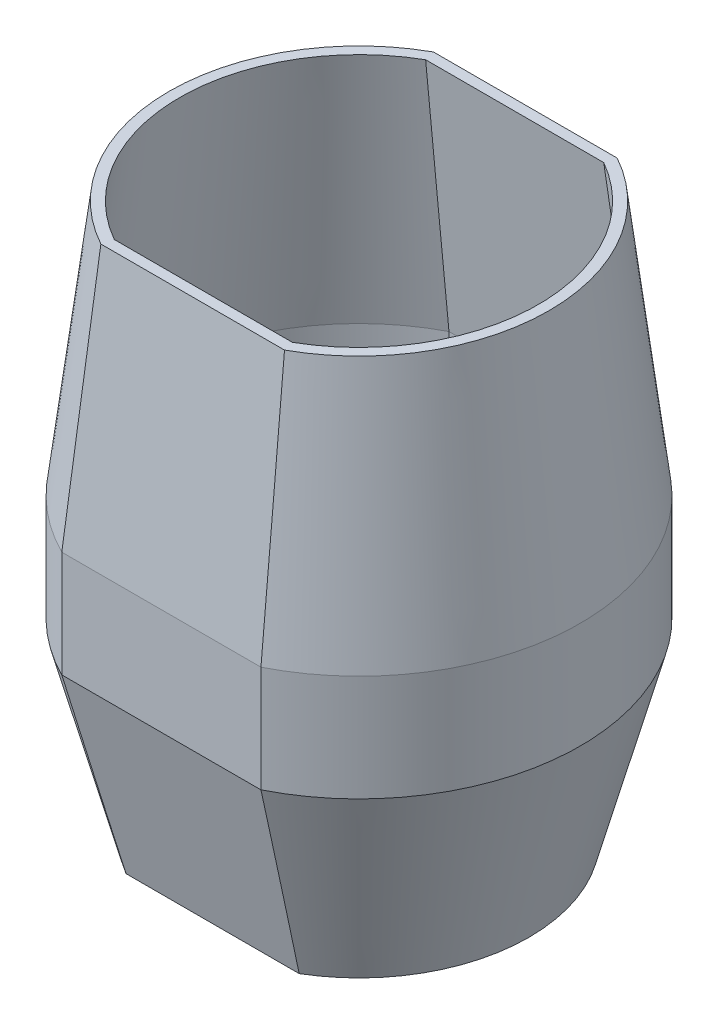
ISO-10303-21;
HEADER;
FILE_DESCRIPTION(('STEP AP214'),'2;1');
FILE_NAME('part.step','',(''),(''),'','','');
FILE_SCHEMA(('AUTOMOTIVE_DESIGN { 1 0 10303 214 1 1 1 1 }'));
ENDSEC;
DATA;
#1=APPLICATION_CONTEXT('core data for automotive mechanical design processes');
#2=APPLICATION_PROTOCOL_DEFINITION('international standard','automotive_design',2000,#1);
#3=PRODUCT_CONTEXT('',#1,'mechanical');
#4=PRODUCT('Part','Part','',(#3));
#5=PRODUCT_RELATED_PRODUCT_CATEGORY('part','',(#4));
#6=PRODUCT_DEFINITION_FORMATION('','',#4);
#7=PRODUCT_DEFINITION_CONTEXT('part definition',#1,'design');
#8=PRODUCT_DEFINITION('design','',#6,#7);
#9=PRODUCT_DEFINITION_SHAPE('','',#8);
#10=(LENGTH_UNIT() NAMED_UNIT(*) SI_UNIT(.MILLI.,.METRE.));
#11=(NAMED_UNIT(*) PLANE_ANGLE_UNIT() SI_UNIT($,.RADIAN.));
#12=(NAMED_UNIT(*) SI_UNIT($,.STERADIAN.) SOLID_ANGLE_UNIT());
#13=UNCERTAINTY_MEASURE_WITH_UNIT(LENGTH_MEASURE(1.E-05),#10,'distance_accuracy_value','');
#14=(GEOMETRIC_REPRESENTATION_CONTEXT(3) GLOBAL_UNCERTAINTY_ASSIGNED_CONTEXT((#13)) GLOBAL_UNIT_ASSIGNED_CONTEXT((#10,
#11,#12)) REPRESENTATION_CONTEXT('',''));
#15=CARTESIAN_POINT('',(0.,0.,0.));
#16=DIRECTION('',(0.,0.,1.));
#17=DIRECTION('',(1.,0.,0.));
#18=AXIS2_PLACEMENT_3D('',#15,#16,#17);
#19=CARTESIAN_POINT('',(0.,260.,0.));
#20=DIRECTION('',(0.,1.,0.));
#21=DIRECTION('',(0.,0.,1.));
#22=AXIS2_PLACEMENT_3D('',#19,#20,#21);
#23=PLANE('',#22);
#24=DIRECTION('',(1.,0.,0.));
#25=VECTOR('',#24,1.);
#26=CARTESIAN_POINT('',(46.8473814173537,260.,-78.2462004007966));
#27=LINE('',#26,#25);
#28=CARTESIAN_POINT('',(43.2035338733453,260.,-78.2462004007966));
#29=VERTEX_POINT('',#28);
#30=CARTESIAN_POINT('',(-43.2035338733453,260.,-78.2462004007966));
#31=VERTEX_POINT('',#30);
#32=EDGE_CURVE('E355',#29,#31,#27,.F.);
#33=ORIENTED_EDGE('',*,*,#32,.T.);
#34=CARTESIAN_POINT('',(0.,260.,0.));
#35=DIRECTION('',(0.,1.,0.));
#36=DIRECTION('',(0.,0.,1.));
#37=AXIS2_PLACEMENT_3D('',#34,#35,#36);
#38=CIRCLE('',#37,89.3812800104525);
#39=CARTESIAN_POINT('',(-43.2035338733452,260.,78.2462004007967));
#40=VERTEX_POINT('',#39);
#41=EDGE_CURVE('E508',#31,#40,#38,.T.);
#42=ORIENTED_EDGE('',*,*,#41,.T.);
#43=DIRECTION('',(-1.,0.,0.));
#44=VECTOR('',#43,1.);
#45=CARTESIAN_POINT('',(-46.8473814173535,260.,78.2462004007967));
#46=LINE('',#45,#44);
#47=CARTESIAN_POINT('',(43.2035338733452,260.,78.2462004007967));
#48=VERTEX_POINT('',#47);
#49=EDGE_CURVE('E502',#40,#48,#46,.F.);
#50=ORIENTED_EDGE('',*,*,#49,.T.);
#51=CARTESIAN_POINT('',(0.,260.,0.));
#52=DIRECTION('',(0.,1.,0.));
#53=DIRECTION('',(0.,0.,1.));
#54=AXIS2_PLACEMENT_3D('',#51,#52,#53);
#55=CIRCLE('',#54,89.3812800104525);
#56=EDGE_CURVE('E498',#48,#29,#55,.T.);
#57=ORIENTED_EDGE('',*,*,#56,.T.);
#58=EDGE_LOOP('',(#33,#42,#50,#57));
#59=FACE_BOUND('',#58,.T.);
#60=DIRECTION('',(-1.,0.,0.));
#61=VECTOR('',#60,1.);
#62=CARTESIAN_POINT('',(0.,260.,-73.2462004007966));
#63=LINE('',#62,#61);
#64=CARTESIAN_POINT('',(41.895041986478,260.,-73.2462004007966));
#65=VERTEX_POINT('',#64);
#66=CARTESIAN_POINT('',(-41.895041986478,260.,-73.2462004007966));
#67=VERTEX_POINT('',#66);
#68=EDGE_CURVE('E12',#65,#67,#63,.T.);
#69=ORIENTED_EDGE('',*,*,#68,.F.);
#70=CARTESIAN_POINT('',(0.,260.,0.));
#71=DIRECTION('',(0.,1.,0.));
#72=DIRECTION('',(0.,0.,1.));
#73=AXIS2_PLACEMENT_3D('',#70,#71,#72);
#74=CIRCLE('',#73,84.3812800104525);
#75=CARTESIAN_POINT('',(41.8950419864777,260.,73.2462004007966));
#76=VERTEX_POINT('',#75);
#77=EDGE_CURVE('E181',#65,#76,#74,.F.);
#78=ORIENTED_EDGE('',*,*,#77,.T.);
#79=DIRECTION('',(1.,0.,0.));
#80=VECTOR('',#79,1.);
#81=CARTESIAN_POINT('',(0.,260.,73.2462004007966));
#82=LINE('',#81,#80);
#83=CARTESIAN_POINT('',(-41.8950419864779,260.,73.2462004007966));
#84=VERTEX_POINT('',#83);
#85=EDGE_CURVE('E343',#76,#84,#82,.F.);
#86=ORIENTED_EDGE('',*,*,#85,.T.);
#87=CARTESIAN_POINT('',(0.,260.,0.));
#88=DIRECTION('',(0.,1.,0.));
#89=DIRECTION('',(0.,0.,1.));
#90=AXIS2_PLACEMENT_3D('',#87,#88,#89);
#91=CIRCLE('',#90,84.3812800104525);
#92=EDGE_CURVE('E72',#84,#67,#91,.F.);
#93=ORIENTED_EDGE('',*,*,#92,.T.);
#94=EDGE_LOOP('',(#69,#78,#86,#93));
#95=FACE_BOUND('',#94,.T.);
#96=ADVANCED_FACE('F63',(#59,#95),#23,.T.);
#97=CARTESIAN_POINT('',(0.,0.,0.));
#98=DIRECTION('',(0.,1.,0.));
#99=DIRECTION('',(0.,0.,1.));
#100=AXIS2_PLACEMENT_3D('',#97,#98,#99);
#101=PLANE('',#100);
#102=CARTESIAN_POINT('',(0.,0.,0.));
#103=DIRECTION('',(0.,1.,0.));
#104=DIRECTION('',(0.,0.,1.));
#105=AXIS2_PLACEMENT_3D('',#102,#103,#104);
#106=CIRCLE('',#105,80.);
#107=CARTESIAN_POINT('',(-40.7139133421435,0.,-68.8649203903441));
#108=VERTEX_POINT('',#107);
#109=CARTESIAN_POINT('',(-40.7139133421434,0.,68.8649203903441));
#110=VERTEX_POINT('',#109);
#111=EDGE_CURVE('E258',#108,#110,#106,.T.);
#112=ORIENTED_EDGE('',*,*,#111,.F.);
#113=DIRECTION('',(1.,0.,0.));
#114=VECTOR('',#113,1.);
#115=CARTESIAN_POINT('',(-40.7139133421435,0.,-68.8649203903441));
#116=LINE('',#115,#114);
#117=CARTESIAN_POINT('',(40.7139133421435,0.,-68.8649203903441));
#118=VERTEX_POINT('',#117);
#119=EDGE_CURVE('E333',#108,#118,#116,.T.);
#120=ORIENTED_EDGE('',*,*,#119,.T.);
#121=CARTESIAN_POINT('',(0.,0.,0.));
#122=DIRECTION('',(0.,1.,0.));
#123=DIRECTION('',(0.,0.,1.));
#124=AXIS2_PLACEMENT_3D('',#121,#122,#123);
#125=CIRCLE('',#124,80.);
#126=CARTESIAN_POINT('',(40.7139133421434,0.,68.8649203903441));
#127=VERTEX_POINT('',#126);
#128=EDGE_CURVE('E533',#127,#118,#125,.T.);
#129=ORIENTED_EDGE('',*,*,#128,.F.);
#130=DIRECTION('',(1.,0.,0.));
#131=VECTOR('',#130,1.);
#132=CARTESIAN_POINT('',(-40.7139133421434,0.,68.8649203903441));
#133=LINE('',#132,#131);
#134=EDGE_CURVE('E484',#110,#127,#133,.T.);
#135=ORIENTED_EDGE('',*,*,#134,.F.);
#136=EDGE_LOOP('',(#112,#120,#129,#135));
#137=FACE_BOUND('',#136,.T.);
#138=CARTESIAN_POINT('',(0.,0.,0.));
#139=DIRECTION('',(0.,1.,0.));
#140=DIRECTION('',(0.,0.,1.));
#141=AXIS2_PLACEMENT_3D('',#138,#139,#140);
#142=CIRCLE('',#141,75.);
#143=CARTESIAN_POINT('',(39.3226645019766,0.,63.8649203903441));
#144=VERTEX_POINT('',#143);
#145=CARTESIAN_POINT('',(39.3226645019766,0.,-63.8649203903441));
#146=VERTEX_POINT('',#145);
#147=EDGE_CURVE('E241',#144,#146,#142,.T.);
#148=ORIENTED_EDGE('',*,*,#147,.T.);
#149=DIRECTION('',(1.,0.,0.));
#150=VECTOR('',#149,1.);
#151=CARTESIAN_POINT('',(-39.3226645019766,0.,-63.8649203903441));
#152=LINE('',#151,#150);
#153=CARTESIAN_POINT('',(-39.3226645019766,0.,-63.8649203903441));
#154=VERTEX_POINT('',#153);
#155=EDGE_CURVE('E87',#154,#146,#152,.T.);
#156=ORIENTED_EDGE('',*,*,#155,.F.);
#157=CARTESIAN_POINT('',(0.,0.,0.));
#158=DIRECTION('',(0.,1.,0.));
#159=DIRECTION('',(0.,0.,1.));
#160=AXIS2_PLACEMENT_3D('',#157,#158,#159);
#161=CIRCLE('',#160,75.);
#162=CARTESIAN_POINT('',(-39.3226645019766,0.,63.8649203903441));
#163=VERTEX_POINT('',#162);
#164=EDGE_CURVE('E247',#154,#163,#161,.T.);
#165=ORIENTED_EDGE('',*,*,#164,.T.);
#166=DIRECTION('',(1.,0.,0.));
#167=VECTOR('',#166,1.);
#168=CARTESIAN_POINT('',(-39.3226645019765,0.,63.8649203903441));
#169=LINE('',#168,#167);
#170=EDGE_CURVE('E244',#163,#144,#169,.T.);
#171=ORIENTED_EDGE('',*,*,#170,.T.);
#172=EDGE_LOOP('',(#148,#156,#165,#171));
#173=FACE_BOUND('',#172,.T.);
#174=ADVANCED_FACE('F295',(#137,#173),#101,.F.);
#175=CARTESIAN_POINT('',(0.,0.,0.));
#176=DIRECTION('',(0.,1.,0.));
#177=DIRECTION('',(0.,0.,1.));
#178=AXIS2_PLACEMENT_3D('',#175,#176,#177);
#179=CONICAL_SURFACE('',#178,80.,0.26179938779915);
#180=ORIENTED_EDGE('',*,*,#111,.T.);
#181=CARTESIAN_POINT('',(-46.8473814173535,90.,92.9803477091452));
#182=CARTESIAN_POINT('',(-46.3695456536516,82.4979146563764,90.9701699997719));
#183=CARTESIAN_POINT('',(-45.884506510705,74.9962542807711,88.9601061602359));
#184=CARTESIAN_POINT('',(-44.898406770819,59.9939562587681,84.9402525206292));
#185=CARTESIAN_POINT('',(-44.3973462582267,52.4933186071948,82.9304627191716));
#186=CARTESIAN_POINT('',(-43.3775832443179,37.4931474472843,78.911178970545));
#187=CARTESIAN_POINT('',(-42.8588807138411,29.9936139407928,76.9016850238704));
#188=CARTESIAN_POINT('',(-41.8017305757207,14.9958066322078,72.8830346672975));
#189=CARTESIAN_POINT('',(-41.2632828640385,7.4975328369611,70.8738782592337));
#190=CARTESIAN_POINT('',(-40.7139133421434,0.,68.8649203903441));
#191=B_SPLINE_CURVE_WITH_KNOTS('',3,(#181,#182,#183,#184,#185,#186,#187,#188,#189,#190),
.UNSPECIFIED.,.F.,.F.,(4,2,2,2,4),(0.,23.3442474820861,46.6883720846454,70.032535274112,
93.3768214829869),.UNSPECIFIED.);
#192=CARTESIAN_POINT('',(-46.8473814173535,90.,92.9803477091452));
#193=VERTEX_POINT('',#192);
#194=EDGE_CURVE('E309',#193,#110,#191,.T.);
#195=ORIENTED_EDGE('',*,*,#194,.F.);
#196=CARTESIAN_POINT('',(0.,90.,0.));
#197=DIRECTION('',(0.,1.,0.));
#198=DIRECTION('',(0.,0.,1.));
#199=AXIS2_PLACEMENT_3D('',#196,#197,#198);
#200=CIRCLE('',#199,104.115427318801);
#201=CARTESIAN_POINT('',(-46.8473814173537,90.,-92.9803477091452));
#202=VERTEX_POINT('',#201);
#203=EDGE_CURVE('E330',#202,#193,#200,.T.);
#204=ORIENTED_EDGE('',*,*,#203,.F.);
#205=CARTESIAN_POINT('',(-46.8473814173537,90.,-92.9803477091452));
#206=CARTESIAN_POINT('',(-46.3695456536518,82.4979146563764,-90.9701699997719));
#207=CARTESIAN_POINT('',(-45.8845065107052,74.9962542807711,-88.9601061602359));
#208=CARTESIAN_POINT('',(-44.8984067708191,59.9939562587681,-84.9402525206292));
#209=CARTESIAN_POINT('',(-44.3973462582269,52.4933186071948,-82.9304627191716));
#210=CARTESIAN_POINT('',(-43.377583244318,37.4931474472843,-78.911178970545));
#211=CARTESIAN_POINT('',(-42.8588807138412,29.9936139407928,-76.9016850238704));
#212=CARTESIAN_POINT('',(-41.8017305757208,14.9958066322078,-72.8830346672975));
#213=CARTESIAN_POINT('',(-41.2632828640386,7.4975328369611,-70.8738782592336));
#214=CARTESIAN_POINT('',(-40.7139133421435,0.,-68.8649203903441));
#215=B_SPLINE_CURVE_WITH_KNOTS('',3,(#205,#206,#207,#208,#209,#210,#211,#212,#213,#214),
.UNSPECIFIED.,.F.,.F.,(4,2,2,2,4),(0.,23.3442474820861,46.6883720846454,70.032535274112,
93.3768214829869),.UNSPECIFIED.);
#216=EDGE_CURVE('E341',#202,#108,#215,.T.);
#217=ORIENTED_EDGE('',*,*,#216,.T.);
#218=EDGE_LOOP('',(#180,#195,#204,#217));
#219=FACE_BOUND('',#218,.T.);
#220=ADVANCED_FACE('F299',(#219),#179,.T.);
#221=CARTESIAN_POINT('',(-40.7139133421434,0.,68.8649203903441));
#222=DIRECTION('',(0.,-0.258819045102521,0.965925826289068));
#223=DIRECTION('',(0.,-0.965925826289068,-0.258819045102521));
#224=AXIS2_PLACEMENT_3D('',#221,#222,#223);
#225=PLANE('',#224);
#226=ORIENTED_EDGE('',*,*,#134,.T.);
#227=CARTESIAN_POINT('',(46.8473814173535,90.,92.9803477091452));
#228=CARTESIAN_POINT('',(46.3695456536517,82.4979146563764,90.9701699997719));
#229=CARTESIAN_POINT('',(45.8845065107051,74.9962542807711,88.9601061602359));
#230=CARTESIAN_POINT('',(44.898406770819,59.9939562587681,84.9402525206292));
#231=CARTESIAN_POINT('',(44.3973462582268,52.4933186071948,82.9304627191716));
#232=CARTESIAN_POINT('',(43.3775832443179,37.4931474472843,78.911178970545));
#233=CARTESIAN_POINT('',(42.8588807138411,29.9936139407928,76.9016850238704));
#234=CARTESIAN_POINT('',(41.8017305757207,14.9958066322078,72.8830346672975));
#235=CARTESIAN_POINT('',(41.2632828640386,7.49753283696109,70.8738782592337));
#236=CARTESIAN_POINT('',(40.7139133421434,0.,68.8649203903441));
#237=B_SPLINE_CURVE_WITH_KNOTS('',3,(#227,#228,#229,#230,#231,#232,#233,#234,#235,#236),
.UNSPECIFIED.,.F.,.F.,(4,2,2,2,4),(0.,23.3442474820861,46.6883720846454,70.032535274112,
93.3768214829869),.UNSPECIFIED.);
#238=CARTESIAN_POINT('',(46.8473814173535,90.,92.9803477091452));
#239=VERTEX_POINT('',#238);
#240=EDGE_CURVE('E317',#239,#127,#237,.T.);
#241=ORIENTED_EDGE('',*,*,#240,.F.);
#242=DIRECTION('',(-1.,0.,0.));
#243=VECTOR('',#242,1.);
#244=CARTESIAN_POINT('',(-40.7139133421434,90.,92.9803477091452));
#245=LINE('',#244,#243);
#246=EDGE_CURVE('E332',#193,#239,#245,.F.);
#247=ORIENTED_EDGE('',*,*,#246,.F.);
#248=ORIENTED_EDGE('',*,*,#194,.T.);
#249=EDGE_LOOP('',(#226,#241,#247,#248));
#250=FACE_BOUND('',#249,.T.);
#251=ADVANCED_FACE('F301',(#250),#225,.T.);
#252=CARTESIAN_POINT('',(0.,0.,0.));
#253=DIRECTION('',(0.,1.,0.));
#254=DIRECTION('',(0.,0.,1.));
#255=AXIS2_PLACEMENT_3D('',#252,#253,#254);
#256=CONICAL_SURFACE('',#255,80.,0.26179938779915);
#257=ORIENTED_EDGE('',*,*,#128,.T.);
#258=CARTESIAN_POINT('',(46.8473814173537,90.,-92.9803477091452));
#259=CARTESIAN_POINT('',(46.3695456536518,82.4979146563763,-90.9701699997719));
#260=CARTESIAN_POINT('',(45.8845065107052,74.9962542807711,-88.9601061602359));
#261=CARTESIAN_POINT('',(44.8984067708191,59.9939562587681,-84.9402525206291));
#262=CARTESIAN_POINT('',(44.3973462582269,52.4933186071947,-82.9304627191716));
#263=CARTESIAN_POINT('',(43.377583244318,37.4931474472843,-78.911178970545));
#264=CARTESIAN_POINT('',(42.8588807138413,29.9936139407927,-76.9016850238704));
#265=CARTESIAN_POINT('',(41.8017305757208,14.9958066322078,-72.8830346672975));
#266=CARTESIAN_POINT('',(41.2632828640387,7.49753283696108,-70.8738782592336));
#267=CARTESIAN_POINT('',(40.7139133421435,0.,-68.8649203903441));
#268=B_SPLINE_CURVE_WITH_KNOTS('',3,(#258,#259,#260,#261,#262,#263,#264,#265,#266,#267),
.UNSPECIFIED.,.F.,.F.,(4,2,2,2,4),(0.,23.3442474820861,46.6883720846454,70.0325352741121,
93.3768214829869),.UNSPECIFIED.);
#269=CARTESIAN_POINT('',(46.8473814173537,90.,-92.9803477091452));
#270=VERTEX_POINT('',#269);
#271=EDGE_CURVE('E325',#270,#118,#268,.T.);
#272=ORIENTED_EDGE('',*,*,#271,.F.);
#273=CARTESIAN_POINT('',(0.,90.,0.));
#274=DIRECTION('',(0.,1.,0.));
#275=DIRECTION('',(0.,0.,1.));
#276=AXIS2_PLACEMENT_3D('',#273,#274,#275);
#277=CIRCLE('',#276,104.115427318801);
#278=EDGE_CURVE('E335',#239,#270,#277,.T.);
#279=ORIENTED_EDGE('',*,*,#278,.F.);
#280=ORIENTED_EDGE('',*,*,#240,.T.);
#281=EDGE_LOOP('',(#257,#272,#279,#280));
#282=FACE_BOUND('',#281,.T.);
#283=ADVANCED_FACE('F65',(#282),#256,.T.);
#284=CARTESIAN_POINT('',(-40.7139133421435,0.,-68.8649203903441));
#285=DIRECTION('',(0.,-0.258819045102521,-0.965925826289068));
#286=DIRECTION('',(0.,0.965925826289068,-0.258819045102521));
#287=AXIS2_PLACEMENT_3D('',#284,#285,#286);
#288=PLANE('',#287);
#289=ORIENTED_EDGE('',*,*,#119,.F.);
#290=ORIENTED_EDGE('',*,*,#216,.F.);
#291=DIRECTION('',(1.,0.,0.));
#292=VECTOR('',#291,1.);
#293=CARTESIAN_POINT('',(-40.7139133421435,90.,-92.9803477091452));
#294=LINE('',#293,#292);
#295=EDGE_CURVE('E338',#202,#270,#294,.T.);
#296=ORIENTED_EDGE('',*,*,#295,.T.);
#297=ORIENTED_EDGE('',*,*,#271,.T.);
#298=EDGE_LOOP('',(#289,#290,#296,#297));
#299=FACE_BOUND('',#298,.T.);
#300=ADVANCED_FACE('F473',(#299),#288,.T.);
#301=CARTESIAN_POINT('',(-39.3226645019766,0.,-63.8649203903441));
#302=DIRECTION('',(0.,-0.258819045102521,-0.965925826289068));
#303=DIRECTION('',(0.,0.965925826289068,-0.258819045102521));
#304=AXIS2_PLACEMENT_3D('',#301,#302,#303);
#305=PLANE('',#304);
#306=ORIENTED_EDGE('',*,*,#155,.T.);
#307=CARTESIAN_POINT('',(45.6434699553666,90.,-87.9803477091452));
#308=CARTESIAN_POINT('',(45.1530067247216,82.4976604831199,-85.9701018942531));
#309=CARTESIAN_POINT('',(44.6547659774556,74.9957914964365,-83.9599821575472));
#310=CARTESIAN_POINT('',(43.640871549344,59.9931996225054,-79.9400497805536));
#311=CARTESIAN_POINT('',(43.125217978232,52.4924767283343,-77.9302371384108));
#312=CARTESIAN_POINT('',(42.0746327687573,37.4922718328349,-73.9109443503604));
#313=CARTESIAN_POINT('',(41.5397010900382,29.9927898341372,-71.9014642051576));
#314=CARTESIAN_POINT('',(40.4480998810277,14.9952556163533,-67.8828870230442));
#315=CARTESIAN_POINT('',(39.8914302136066,7.49720340658658,-65.8737899886308));
#316=CARTESIAN_POINT('',(39.3226645019766,0.,-63.8649203903441));
#317=B_SPLINE_CURVE_WITH_KNOTS('',3,(#307,#308,#309,#310,#311,#312,#313,#314,#315,#316),
.UNSPECIFIED.,.F.,.F.,(4,2,2,2,4),(0.,23.3473927526677,46.6946384000034,70.0419329246854,
93.3893747547588),.UNSPECIFIED.);
#318=CARTESIAN_POINT('',(45.6434699553666,90.,-87.9803477091452));
#319=VERTEX_POINT('',#318);
#320=EDGE_CURVE('E260',#319,#146,#317,.T.);
#321=ORIENTED_EDGE('',*,*,#320,.F.);
#322=DIRECTION('',(1.,0.,0.));
#323=VECTOR('',#322,1.);
#324=CARTESIAN_POINT('',(-39.3226645019766,90.,-87.9803477091452));
#325=LINE('',#324,#323);
#326=CARTESIAN_POINT('',(-45.6434699553666,90.,-87.9803477091452));
#327=VERTEX_POINT('',#326);
#328=EDGE_CURVE('E208',#327,#319,#325,.T.);
#329=ORIENTED_EDGE('',*,*,#328,.F.);
#330=CARTESIAN_POINT('',(-45.6434699553666,90.,-87.9803477091452));
#331=CARTESIAN_POINT('',(-45.1530067247216,82.4976604831199,-85.9701018942531));
#332=CARTESIAN_POINT('',(-44.6547659774556,74.9957914964365,-83.9599821575472));
#333=CARTESIAN_POINT('',(-43.640871549344,59.9931996225054,-79.9400497805536));
#334=CARTESIAN_POINT('',(-43.125217978232,52.4924767283343,-77.9302371384108));
#335=CARTESIAN_POINT('',(-42.0746327687573,37.4922718328349,-73.9109443503604));
#336=CARTESIAN_POINT('',(-41.5397010900382,29.9927898341372,-71.9014642051576));
#337=CARTESIAN_POINT('',(-40.4480998810277,14.9952556163533,-67.8828870230442));
#338=CARTESIAN_POINT('',(-39.8914302136066,7.49720340658658,-65.8737899886308));
#339=CARTESIAN_POINT('',(-39.3226645019766,0.,-63.8649203903441));
#340=B_SPLINE_CURVE_WITH_KNOTS('',3,(#330,#331,#332,#333,#334,#335,#336,#337,#338,#339),
.UNSPECIFIED.,.F.,.F.,(4,2,2,2,4),(0.,23.3473927526677,46.6946384000034,70.0419329246854,
93.3893747547588),.UNSPECIFIED.);
#341=EDGE_CURVE('E250',#327,#154,#340,.T.);
#342=ORIENTED_EDGE('',*,*,#341,.T.);
#343=EDGE_LOOP('',(#306,#321,#329,#342));
#344=FACE_BOUND('',#343,.T.);
#345=ADVANCED_FACE('F267',(#344),#305,.F.);
#346=CARTESIAN_POINT('',(0.,0.,0.));
#347=DIRECTION('',(0.,1.,0.));
#348=DIRECTION('',(0.,0.,1.));
#349=AXIS2_PLACEMENT_3D('',#346,#347,#348);
#350=CONICAL_SURFACE('',#349,75.,0.26179938779915);
#351=ORIENTED_EDGE('',*,*,#164,.F.);
#352=ORIENTED_EDGE('',*,*,#341,.F.);
#353=CARTESIAN_POINT('',(0.,90.,0.));
#354=DIRECTION('',(0.,1.,0.));
#355=DIRECTION('',(0.,0.,1.));
#356=AXIS2_PLACEMENT_3D('',#353,#354,#355);
#357=CIRCLE('',#356,99.1154273188011);
#358=CARTESIAN_POINT('',(-45.6434699553665,90.,87.9803477091452));
#359=VERTEX_POINT('',#358);
#360=EDGE_CURVE('E517',#327,#359,#357,.T.);
#361=ORIENTED_EDGE('',*,*,#360,.T.);
#362=CARTESIAN_POINT('',(-45.6434699553665,90.,87.9803477091452));
#363=CARTESIAN_POINT('',(-45.1530067247215,82.4976604831199,85.9701018942531));
#364=CARTESIAN_POINT('',(-44.6547659774555,74.9957914964365,83.9599821575472));
#365=CARTESIAN_POINT('',(-43.6408715493439,59.9931996225054,79.9400497805536));
#366=CARTESIAN_POINT('',(-43.125217978232,52.4924767283343,77.9302371384108));
#367=CARTESIAN_POINT('',(-42.0746327687572,37.4922718328349,73.9109443503604));
#368=CARTESIAN_POINT('',(-41.5397010900381,29.9927898341372,71.9014642051576));
#369=CARTESIAN_POINT('',(-40.4480998810276,14.9952556163533,67.8828870230442));
#370=CARTESIAN_POINT('',(-39.8914302136065,7.49720340658655,65.8737899886308));
#371=CARTESIAN_POINT('',(-39.3226645019765,0.,63.8649203903441));
#372=B_SPLINE_CURVE_WITH_KNOTS('',3,(#362,#363,#364,#365,#366,#367,#368,#369,#370,#371),
.UNSPECIFIED.,.F.,.F.,(4,2,2,2,4),(0.,23.3473927526677,46.6946384000034,70.0419329246854,
93.3893747547588),.UNSPECIFIED.);
#373=EDGE_CURVE('E259',#359,#163,#372,.T.);
#374=ORIENTED_EDGE('',*,*,#373,.T.);
#375=EDGE_LOOP('',(#351,#352,#361,#374));
#376=FACE_BOUND('',#375,.T.);
#377=ADVANCED_FACE('F270',(#376),#350,.F.);
#378=CARTESIAN_POINT('',(-39.3226645019765,0.,63.8649203903441));
#379=DIRECTION('',(0.,-0.258819045102521,0.965925826289068));
#380=DIRECTION('',(0.,-0.965925826289068,-0.258819045102521));
#381=AXIS2_PLACEMENT_3D('',#378,#379,#380);
#382=PLANE('',#381);
#383=ORIENTED_EDGE('',*,*,#170,.F.);
#384=ORIENTED_EDGE('',*,*,#373,.F.);
#385=DIRECTION('',(-1.,0.,0.));
#386=VECTOR('',#385,1.);
#387=CARTESIAN_POINT('',(-39.3226645019765,90.,87.9803477091452));
#388=LINE('',#387,#386);
#389=CARTESIAN_POINT('',(45.6434699553665,90.,87.9803477091452));
#390=VERTEX_POINT('',#389);
#391=EDGE_CURVE('E522',#359,#390,#388,.F.);
#392=ORIENTED_EDGE('',*,*,#391,.T.);
#393=CARTESIAN_POINT('',(45.6434699553665,90.,87.9803477091452));
#394=CARTESIAN_POINT('',(45.1530067247215,82.4976604831199,85.9701018942531));
#395=CARTESIAN_POINT('',(44.6547659774555,74.9957914964364,83.9599821575472));
#396=CARTESIAN_POINT('',(43.6408715493439,59.9931996225054,79.9400497805536));
#397=CARTESIAN_POINT('',(43.1252179782319,52.4924767283343,77.9302371384108));
#398=CARTESIAN_POINT('',(42.0746327687572,37.4922718328349,73.9109443503604));
#399=CARTESIAN_POINT('',(41.5397010900381,29.9927898341372,71.9014642051576));
#400=CARTESIAN_POINT('',(40.4480998810276,14.9952556163533,67.8828870230442));
#401=CARTESIAN_POINT('',(39.8914302136065,7.49720340658658,65.8737899886309));
#402=CARTESIAN_POINT('',(39.3226645019765,0.,63.8649203903441));
#403=B_SPLINE_CURVE_WITH_KNOTS('',3,(#393,#394,#395,#396,#397,#398,#399,#400,#401,#402),
.UNSPECIFIED.,.F.,.F.,(4,2,2,2,4),(0.,23.3473927526678,46.6946384000034,70.0419329246854,
93.3893747547587),.UNSPECIFIED.);
#404=EDGE_CURVE('E285',#390,#144,#403,.T.);
#405=ORIENTED_EDGE('',*,*,#404,.T.);
#406=EDGE_LOOP('',(#383,#384,#392,#405));
#407=FACE_BOUND('',#406,.T.);
#408=ADVANCED_FACE('F273',(#407),#382,.F.);
#409=CARTESIAN_POINT('',(0.,0.,0.));
#410=DIRECTION('',(0.,1.,0.));
#411=DIRECTION('',(0.,0.,1.));
#412=AXIS2_PLACEMENT_3D('',#409,#410,#411);
#413=CONICAL_SURFACE('',#412,75.,0.26179938779915);
#414=ORIENTED_EDGE('',*,*,#147,.F.);
#415=ORIENTED_EDGE('',*,*,#404,.F.);
#416=CARTESIAN_POINT('',(0.,90.,0.));
#417=DIRECTION('',(0.,1.,0.));
#418=DIRECTION('',(0.,0.,1.));
#419=AXIS2_PLACEMENT_3D('',#416,#417,#418);
#420=CIRCLE('',#419,99.1154273188011);
#421=EDGE_CURVE('E527',#390,#319,#420,.T.);
#422=ORIENTED_EDGE('',*,*,#421,.T.);
#423=ORIENTED_EDGE('',*,*,#320,.T.);
#424=EDGE_LOOP('',(#414,#415,#422,#423));
#425=FACE_BOUND('',#424,.T.);
#426=ADVANCED_FACE('F275',(#425),#413,.F.);
#427=CARTESIAN_POINT('',(46.8473814173537,140.,-92.9803477091452));
#428=DIRECTION('',(0.,0.,1.));
#429=DIRECTION('',(1.,0.,0.));
#430=AXIS2_PLACEMENT_3D('',#427,#428,#429);
#431=PLANE('',#430);
#432=ORIENTED_EDGE('',*,*,#295,.F.);
#433=DIRECTION('',(0.,-1.,0.));
#434=VECTOR('',#433,1.);
#435=CARTESIAN_POINT('',(-46.8473814173537,140.,-92.9803477091452));
#436=LINE('',#435,#434);
#437=CARTESIAN_POINT('',(-46.8473814173537,140.,-92.9803477091452));
#438=VERTEX_POINT('',#437);
#439=EDGE_CURVE('E238',#438,#202,#436,.T.);
#440=ORIENTED_EDGE('',*,*,#439,.F.);
#441=DIRECTION('',(-1.,0.,0.));
#442=VECTOR('',#441,1.);
#443=CARTESIAN_POINT('',(46.8473814173537,140.,-92.9803477091452));
#444=LINE('',#443,#442);
#445=CARTESIAN_POINT('',(46.8473814173537,140.,-92.9803477091452));
#446=VERTEX_POINT('',#445);
#447=EDGE_CURVE('E217',#446,#438,#444,.T.);
#448=ORIENTED_EDGE('',*,*,#447,.F.);
#449=DIRECTION('',(0.,-1.,0.));
#450=VECTOR('',#449,1.);
#451=CARTESIAN_POINT('',(46.8473814173537,140.,-92.9803477091452));
#452=LINE('',#451,#450);
#453=EDGE_CURVE('E230',#446,#270,#452,.T.);
#454=ORIENTED_EDGE('',*,*,#453,.T.);
#455=EDGE_LOOP('',(#432,#440,#448,#454));
#456=FACE_BOUND('',#455,.T.);
#457=ADVANCED_FACE('F457',(#456),#431,.F.);
#458=CARTESIAN_POINT('',(0.,140.,0.));
#459=DIRECTION('',(0.,-1.,0.));
#460=DIRECTION('',(0.,0.,-1.));
#461=AXIS2_PLACEMENT_3D('',#458,#459,#460);
#462=CYLINDRICAL_SURFACE('',#461,104.115427318801);
#463=ORIENTED_EDGE('',*,*,#203,.T.);
#464=DIRECTION('',(0.,-1.,0.));
#465=VECTOR('',#464,1.);
#466=CARTESIAN_POINT('',(-46.8473814173535,140.,92.9803477091452));
#467=LINE('',#466,#465);
#468=CARTESIAN_POINT('',(-46.8473814173535,140.,92.9803477091452));
#469=VERTEX_POINT('',#468);
#470=EDGE_CURVE('E235',#469,#193,#467,.T.);
#471=ORIENTED_EDGE('',*,*,#470,.F.);
#472=CARTESIAN_POINT('',(0.,140.,0.));
#473=DIRECTION('',(0.,1.,0.));
#474=DIRECTION('',(0.,0.,1.));
#475=AXIS2_PLACEMENT_3D('',#472,#473,#474);
#476=CIRCLE('',#475,104.115427318801);
#477=EDGE_CURVE('E220',#438,#469,#476,.T.);
#478=ORIENTED_EDGE('',*,*,#477,.F.);
#479=ORIENTED_EDGE('',*,*,#439,.T.);
#480=EDGE_LOOP('',(#463,#471,#478,#479));
#481=FACE_BOUND('',#480,.T.);
#482=ADVANCED_FACE('F454',(#481),#462,.T.);
#483=CARTESIAN_POINT('',(-46.8473814173535,140.,92.9803477091452));
#484=DIRECTION('',(0.,0.,-1.));
#485=DIRECTION('',(-1.,0.,0.));
#486=AXIS2_PLACEMENT_3D('',#483,#484,#485);
#487=PLANE('',#486);
#488=ORIENTED_EDGE('',*,*,#246,.T.);
#489=DIRECTION('',(0.,-1.,0.));
#490=VECTOR('',#489,1.);
#491=CARTESIAN_POINT('',(46.8473814173535,140.,92.9803477091452));
#492=LINE('',#491,#490);
#493=CARTESIAN_POINT('',(46.8473814173535,140.,92.9803477091452));
#494=VERTEX_POINT('',#493);
#495=EDGE_CURVE('E232',#494,#239,#492,.T.);
#496=ORIENTED_EDGE('',*,*,#495,.F.);
#497=DIRECTION('',(1.,0.,0.));
#498=VECTOR('',#497,1.);
#499=CARTESIAN_POINT('',(-46.8473814173535,140.,92.9803477091452));
#500=LINE('',#499,#498);
#501=EDGE_CURVE('E224',#469,#494,#500,.T.);
#502=ORIENTED_EDGE('',*,*,#501,.F.);
#503=ORIENTED_EDGE('',*,*,#470,.T.);
#504=EDGE_LOOP('',(#488,#496,#502,#503));
#505=FACE_BOUND('',#504,.T.);
#506=ADVANCED_FACE('F450',(#505),#487,.F.);
#507=CARTESIAN_POINT('',(0.,140.,0.));
#508=DIRECTION('',(0.,-1.,0.));
#509=DIRECTION('',(0.,0.,-1.));
#510=AXIS2_PLACEMENT_3D('',#507,#508,#509);
#511=CYLINDRICAL_SURFACE('',#510,104.115427318801);
#512=ORIENTED_EDGE('',*,*,#278,.T.);
#513=ORIENTED_EDGE('',*,*,#453,.F.);
#514=CARTESIAN_POINT('',(0.,140.,0.));
#515=DIRECTION('',(0.,1.,0.));
#516=DIRECTION('',(0.,0.,1.));
#517=AXIS2_PLACEMENT_3D('',#514,#515,#516);
#518=CIRCLE('',#517,104.115427318801);
#519=EDGE_CURVE('E227',#494,#446,#518,.T.);
#520=ORIENTED_EDGE('',*,*,#519,.F.);
#521=ORIENTED_EDGE('',*,*,#495,.T.);
#522=EDGE_LOOP('',(#512,#513,#520,#521));
#523=FACE_BOUND('',#522,.T.);
#524=ADVANCED_FACE('F447',(#523),#511,.T.);
#525=CARTESIAN_POINT('',(-45.6434699553666,140.,-87.9803477091452));
#526=DIRECTION('',(0.,0.,-1.));
#527=DIRECTION('',(-1.,0.,0.));
#528=AXIS2_PLACEMENT_3D('',#525,#526,#527);
#529=PLANE('',#528);
#530=ORIENTED_EDGE('',*,*,#328,.T.);
#531=DIRECTION('',(0.,-1.,0.));
#532=VECTOR('',#531,1.);
#533=CARTESIAN_POINT('',(45.6434699553666,140.,-87.9803477091452));
#534=LINE('',#533,#532);
#535=CARTESIAN_POINT('',(45.6434699553666,140.,-87.9803477091452));
#536=VERTEX_POINT('',#535);
#537=EDGE_CURVE('E200',#536,#319,#534,.T.);
#538=ORIENTED_EDGE('',*,*,#537,.F.);
#539=DIRECTION('',(1.,0.,0.));
#540=VECTOR('',#539,1.);
#541=CARTESIAN_POINT('',(-45.6434699553666,140.,-87.9803477091452));
#542=LINE('',#541,#540);
#543=CARTESIAN_POINT('',(-45.6434699553666,140.,-87.9803477091452));
#544=VERTEX_POINT('',#543);
#545=EDGE_CURVE('E186',#544,#536,#542,.T.);
#546=ORIENTED_EDGE('',*,*,#545,.F.);
#547=DIRECTION('',(0.,-1.,0.));
#548=VECTOR('',#547,1.);
#549=CARTESIAN_POINT('',(-45.6434699553666,140.,-87.9803477091452));
#550=LINE('',#549,#548);
#551=EDGE_CURVE('E221',#544,#327,#550,.T.);
#552=ORIENTED_EDGE('',*,*,#551,.T.);
#553=EDGE_LOOP('',(#530,#538,#546,#552));
#554=FACE_BOUND('',#553,.T.);
#555=ADVANCED_FACE('F206',(#554),#529,.F.);
#556=CARTESIAN_POINT('',(0.,140.,0.));
#557=DIRECTION('',(0.,-1.,0.));
#558=DIRECTION('',(0.,0.,-1.));
#559=AXIS2_PLACEMENT_3D('',#556,#557,#558);
#560=CYLINDRICAL_SURFACE('',#559,99.1154273188011);
#561=ORIENTED_EDGE('',*,*,#360,.F.);
#562=ORIENTED_EDGE('',*,*,#551,.F.);
#563=CARTESIAN_POINT('',(0.,140.,0.));
#564=DIRECTION('',(0.,1.,0.));
#565=DIRECTION('',(0.,0.,1.));
#566=AXIS2_PLACEMENT_3D('',#563,#564,#565);
#567=CIRCLE('',#566,99.1154273188011);
#568=CARTESIAN_POINT('',(-45.6434699553665,140.,87.9803477091452));
#569=VERTEX_POINT('',#568);
#570=EDGE_CURVE('E209',#544,#569,#567,.T.);
#571=ORIENTED_EDGE('',*,*,#570,.T.);
#572=DIRECTION('',(0.,-1.,0.));
#573=VECTOR('',#572,1.);
#574=CARTESIAN_POINT('',(-45.6434699553665,140.,87.9803477091452));
#575=LINE('',#574,#573);
#576=EDGE_CURVE('E211',#569,#359,#575,.T.);
#577=ORIENTED_EDGE('',*,*,#576,.T.);
#578=EDGE_LOOP('',(#561,#562,#571,#577));
#579=FACE_BOUND('',#578,.T.);
#580=ADVANCED_FACE('F434',(#579),#560,.F.);
#581=CARTESIAN_POINT('',(-45.6434699553665,140.,87.9803477091452));
#582=DIRECTION('',(0.,0.,-1.));
#583=DIRECTION('',(-1.,0.,0.));
#584=AXIS2_PLACEMENT_3D('',#581,#582,#583);
#585=PLANE('',#584);
#586=ORIENTED_EDGE('',*,*,#391,.F.);
#587=ORIENTED_EDGE('',*,*,#576,.F.);
#588=DIRECTION('',(1.,0.,0.));
#589=VECTOR('',#588,1.);
#590=CARTESIAN_POINT('',(-45.6434699553665,140.,87.9803477091452));
#591=LINE('',#590,#589);
#592=CARTESIAN_POINT('',(45.6434699553665,140.,87.9803477091452));
#593=VERTEX_POINT('',#592);
#594=EDGE_CURVE('E204',#569,#593,#591,.T.);
#595=ORIENTED_EDGE('',*,*,#594,.T.);
#596=DIRECTION('',(0.,-1.,0.));
#597=VECTOR('',#596,1.);
#598=CARTESIAN_POINT('',(45.6434699553665,140.,87.9803477091452));
#599=LINE('',#598,#597);
#600=EDGE_CURVE('E202',#593,#390,#599,.T.);
#601=ORIENTED_EDGE('',*,*,#600,.T.);
#602=EDGE_LOOP('',(#586,#587,#595,#601));
#603=FACE_BOUND('',#602,.T.);
#604=ADVANCED_FACE('F438',(#603),#585,.T.);
#605=CARTESIAN_POINT('',(0.,140.,0.));
#606=DIRECTION('',(0.,-1.,0.));
#607=DIRECTION('',(0.,0.,-1.));
#608=AXIS2_PLACEMENT_3D('',#605,#606,#607);
#609=CYLINDRICAL_SURFACE('',#608,99.1154273188011);
#610=ORIENTED_EDGE('',*,*,#421,.F.);
#611=ORIENTED_EDGE('',*,*,#600,.F.);
#612=CARTESIAN_POINT('',(0.,140.,0.));
#613=DIRECTION('',(0.,1.,0.));
#614=DIRECTION('',(0.,0.,1.));
#615=AXIS2_PLACEMENT_3D('',#612,#613,#614);
#616=CIRCLE('',#615,99.1154273188011);
#617=EDGE_CURVE('E179',#593,#536,#616,.T.);
#618=ORIENTED_EDGE('',*,*,#617,.T.);
#619=ORIENTED_EDGE('',*,*,#537,.T.);
#620=EDGE_LOOP('',(#610,#611,#618,#619));
#621=FACE_BOUND('',#620,.T.);
#622=ADVANCED_FACE('F199',(#621),#609,.F.);
#623=CARTESIAN_POINT('',(46.8473814173537,140.,-92.9803477091452));
#624=DIRECTION('',(0.,0.121869343405148,-0.992546151641322));
#625=DIRECTION('',(0.,0.992546151641322,0.121869343405148));
#626=AXIS2_PLACEMENT_3D('',#623,#624,#625);
#627=PLANE('',#626);
#628=ORIENTED_EDGE('',*,*,#447,.T.);
#629=CARTESIAN_POINT('',(-43.2035338733453,260.,-78.2462004007966));
#630=CARTESIAN_POINT('',(-43.5199735371683,250.000385687078,-79.4739986534072));
#631=CARTESIAN_POINT('',(-43.8329547730067,240.000663834163,-80.7018101102685));
#632=CARTESIAN_POINT('',(-44.4524003396257,220.001024950952,-83.1574569887602));
#633=CARTESIAN_POINT('',(-44.758864672825,210.001107920731,-84.3852924103815));
#634=CARTESIAN_POINT('',(-45.3656765988083,190.001091840676,-86.840985602822));
#635=CARTESIAN_POINT('',(-45.6660241920066,180.000992790856,-88.0688433736397));
#636=CARTESIAN_POINT('',(-46.2609465308134,160.000621778633,-90.5245801462707));
#637=CARTESIAN_POINT('',(-46.5555212742799,150.000349816167,-91.7524591480917));
#638=CARTESIAN_POINT('',(-46.8473814173537,140.,-92.9803477091452));
#639=B_SPLINE_CURVE_WITH_KNOTS('',3,(#629,#630,#631,#632,#633,#634,#635,#636,#637,#638),
.UNSPECIFIED.,.F.,.F.,(4,2,2,2,4),(0.,30.2390330681357,60.4780549138954,90.7170747114302,
120.956105728862),.UNSPECIFIED.);
#640=EDGE_CURVE('E193',#31,#438,#639,.T.);
#641=ORIENTED_EDGE('',*,*,#640,.F.);
#642=ORIENTED_EDGE('',*,*,#32,.F.);
#643=CARTESIAN_POINT('',(43.2035338733453,260.,-78.2462004007966));
#644=CARTESIAN_POINT('',(43.5199735371683,250.000385687078,-79.4739986534072));
#645=CARTESIAN_POINT('',(43.8329547730067,240.000663834163,-80.7018101102685));
#646=CARTESIAN_POINT('',(44.4524003396257,220.001024950952,-83.1574569887602));
#647=CARTESIAN_POINT('',(44.758864672825,210.001107920731,-84.3852924103815));
#648=CARTESIAN_POINT('',(45.3656765988083,190.001091840676,-86.840985602822));
#649=CARTESIAN_POINT('',(45.6660241920066,180.000992790856,-88.0688433736397));
#650=CARTESIAN_POINT('',(46.2609465308134,160.000621778633,-90.5245801462707));
#651=CARTESIAN_POINT('',(46.5555212742799,150.000349816167,-91.7524591480917));
#652=CARTESIAN_POINT('',(46.8473814173537,140.,-92.9803477091452));
#653=B_SPLINE_CURVE_WITH_KNOTS('',3,(#643,#644,#645,#646,#647,#648,#649,#650,#651,#652),
.UNSPECIFIED.,.F.,.F.,(4,2,2,2,4),(0.,30.2390330681357,60.4780549138954,90.7170747114302,
120.956105728862),.UNSPECIFIED.);
#654=EDGE_CURVE('E499',#29,#446,#653,.T.);
#655=ORIENTED_EDGE('',*,*,#654,.T.);
#656=EDGE_LOOP('',(#628,#641,#642,#655));
#657=FACE_BOUND('',#656,.T.);
#658=ADVANCED_FACE('F407',(#657),#627,.T.);
#659=CARTESIAN_POINT('',(0.,140.,0.));
#660=DIRECTION('',(0.,-1.,0.));
#661=DIRECTION('',(0.,0.,1.));
#662=AXIS2_PLACEMENT_3D('',#659,#660,#661);
#663=CONICAL_SURFACE('',#662,104.115427318801,0.122173047639603);
#664=ORIENTED_EDGE('',*,*,#477,.T.);
#665=CARTESIAN_POINT('',(-43.2035338733452,260.,78.2462004007967));
#666=CARTESIAN_POINT('',(-43.5199735371682,250.000385687078,79.4739986534072));
#667=CARTESIAN_POINT('',(-43.8329547730065,240.000663834163,80.7018101102686));
#668=CARTESIAN_POINT('',(-44.4524003396256,220.001024950952,83.1574569887602));
#669=CARTESIAN_POINT('',(-44.7588646728249,210.001107920731,84.3852924103815));
#670=CARTESIAN_POINT('',(-45.3656765988081,190.001091840676,86.840985602822));
#671=CARTESIAN_POINT('',(-45.6660241920064,180.000992790856,88.0688433736397));
#672=CARTESIAN_POINT('',(-46.2609465308133,160.000621778633,90.5245801462708));
#673=CARTESIAN_POINT('',(-46.5555212742798,150.000349816167,91.7524591480918));
#674=CARTESIAN_POINT('',(-46.8473814173535,140.,92.9803477091452));
#675=B_SPLINE_CURVE_WITH_KNOTS('',3,(#665,#666,#667,#668,#669,#670,#671,#672,#673,#674),
.UNSPECIFIED.,.F.,.F.,(4,2,2,2,4),(0.,30.2390330681357,60.4780549138954,90.7170747114302,
120.956105728862),.UNSPECIFIED.);
#676=EDGE_CURVE('E413',#40,#469,#675,.T.);
#677=ORIENTED_EDGE('',*,*,#676,.F.);
#678=ORIENTED_EDGE('',*,*,#41,.F.);
#679=ORIENTED_EDGE('',*,*,#640,.T.);
#680=EDGE_LOOP('',(#664,#677,#678,#679));
#681=FACE_BOUND('',#680,.T.);
#682=ADVANCED_FACE('F403',(#681),#663,.T.);
#683=CARTESIAN_POINT('',(-46.8473814173535,140.,92.9803477091452));
#684=DIRECTION('',(0.,0.121869343405148,0.992546151641322));
#685=DIRECTION('',(0.,-0.992546151641322,0.121869343405148));
#686=AXIS2_PLACEMENT_3D('',#683,#684,#685);
#687=PLANE('',#686);
#688=ORIENTED_EDGE('',*,*,#501,.T.);
#689=CARTESIAN_POINT('',(43.2035338733452,260.,78.2462004007967));
#690=CARTESIAN_POINT('',(43.5199735371682,250.000385687078,79.4739986534072));
#691=CARTESIAN_POINT('',(43.8329547730065,240.000663834163,80.7018101102686));
#692=CARTESIAN_POINT('',(44.4524003396256,220.001024950952,83.1574569887602));
#693=CARTESIAN_POINT('',(44.7588646728249,210.001107920731,84.3852924103815));
#694=CARTESIAN_POINT('',(45.3656765988082,190.001091840676,86.840985602822));
#695=CARTESIAN_POINT('',(45.6660241920064,180.000992790856,88.0688433736397));
#696=CARTESIAN_POINT('',(46.2609465308132,160.000621778633,90.5245801462708));
#697=CARTESIAN_POINT('',(46.5555212742798,150.000349816167,91.7524591480918));
#698=CARTESIAN_POINT('',(46.8473814173536,140.,92.9803477091452));
#699=B_SPLINE_CURVE_WITH_KNOTS('',3,(#689,#690,#691,#692,#693,#694,#695,#696,#697,#698),
.UNSPECIFIED.,.F.,.F.,(4,2,2,2,4),(0.,30.2390330681357,60.4780549138954,90.7170747114302,
120.956105728862),.UNSPECIFIED.);
#700=EDGE_CURVE('E422',#48,#494,#699,.T.);
#701=ORIENTED_EDGE('',*,*,#700,.F.);
#702=ORIENTED_EDGE('',*,*,#49,.F.);
#703=ORIENTED_EDGE('',*,*,#676,.T.);
#704=EDGE_LOOP('',(#688,#701,#702,#703));
#705=FACE_BOUND('',#704,.T.);
#706=ADVANCED_FACE('F406',(#705),#687,.T.);
#707=CARTESIAN_POINT('',(0.,140.,0.));
#708=DIRECTION('',(0.,-1.,0.));
#709=DIRECTION('',(0.,0.,1.));
#710=AXIS2_PLACEMENT_3D('',#707,#708,#709);
#711=CONICAL_SURFACE('',#710,104.115427318801,0.122173047639603);
#712=ORIENTED_EDGE('',*,*,#519,.T.);
#713=ORIENTED_EDGE('',*,*,#654,.F.);
#714=ORIENTED_EDGE('',*,*,#56,.F.);
#715=ORIENTED_EDGE('',*,*,#700,.T.);
#716=EDGE_LOOP('',(#712,#713,#714,#715));
#717=FACE_BOUND('',#716,.T.);
#718=ADVANCED_FACE('F431',(#717),#711,.T.);
#719=CARTESIAN_POINT('',(-45.6434699553666,140.,-87.9803477091452));
#720=DIRECTION('',(0.,0.121869343405148,-0.992546151641322));
#721=DIRECTION('',(0.,0.992546151641322,0.121869343405148));
#722=AXIS2_PLACEMENT_3D('',#719,#720,#721);
#723=PLANE('',#722);
#724=ORIENTED_EDGE('',*,*,#68,.T.);
#725=CARTESIAN_POINT('',(-40.5686735574322,300.,-68.3348179646804));
#726=CARTESIAN_POINT('',(-40.96335356036,288.288345612628,-69.7728283060804));
#727=CARTESIAN_POINT('',(-41.3523171465771,276.576502974759,-71.2108617617352));
#728=CARTESIAN_POINT('',(-42.1196644343766,253.152477049703,-74.0869704995213));
#729=CARTESIAN_POINT('',(-42.4980481367857,241.440293762545,-75.5250457816495));
#730=CARTESIAN_POINT('',(-43.6186078529725,206.303317805168,-79.8393239460319));
#731=CARTESIAN_POINT('',(-44.3461936113105,182.878065194967,-82.7155833018151));
#732=CARTESIAN_POINT('',(-45.155399003282,156.210283241866,-85.989975199181));
#733=CARTESIAN_POINT('',(-45.253454112388,152.968240068077,-86.3880480467029));
#734=CARTESIAN_POINT('',(-45.4489329509793,146.484134349181,-87.1841961202456));
#735=CARTESIAN_POINT('',(-45.5463566803442,143.24207180407,-87.5822713462667));
#736=CARTESIAN_POINT('',(-45.6434699553666,140.,-87.9803477091452));
#737=B_SPLINE_CURVE_WITH_KNOTS('',3,(#725,#726,#727,#728,#729,#730,#731,#732,#733,#734,#735,
#736),.UNSPECIFIED.,.F.,.F.,(4,2,2,2,2,4),(0.,35.4186132885196,70.8372238095888,
141.674342500405,151.477927936462,161.281515243349),.UNSPECIFIED.);
#738=EDGE_CURVE('E189',#67,#544,#737,.T.);
#739=ORIENTED_EDGE('',*,*,#738,.T.);
#740=ORIENTED_EDGE('',*,*,#545,.T.);
#741=CARTESIAN_POINT('',(40.5686735574322,300.,-68.3348179646804));
#742=CARTESIAN_POINT('',(40.96335356036,288.288345612628,-69.7728283060804));
#743=CARTESIAN_POINT('',(41.3523171465771,276.576502974759,-71.2108617617352));
#744=CARTESIAN_POINT('',(42.1196644343766,253.152477049703,-74.0869704995213));
#745=CARTESIAN_POINT('',(42.4980481367857,241.440293762545,-75.5250457816494));
#746=CARTESIAN_POINT('',(43.6186078529726,206.303317805168,-79.8393239460319));
#747=CARTESIAN_POINT('',(44.3461936113107,182.878065194967,-82.715583301815));
#748=CARTESIAN_POINT('',(45.1553990032821,156.210283241866,-85.9899751991809));
#749=CARTESIAN_POINT('',(45.253454112388,152.968240068077,-86.3880480467029));
#750=CARTESIAN_POINT('',(45.4489329509794,146.484134349181,-87.1841961202456));
#751=CARTESIAN_POINT('',(45.5463566803442,143.24207180407,-87.5822713462667));
#752=CARTESIAN_POINT('',(45.6434699553667,140.,-87.9803477091452));
#753=B_SPLINE_CURVE_WITH_KNOTS('',3,(#741,#742,#743,#744,#745,#746,#747,#748,#749,#750,#751,
#752),.UNSPECIFIED.,.F.,.F.,(4,2,2,2,2,4),(0.,35.4186132885196,70.8372238095888,
141.674342500405,151.477927936462,161.281515243349),.UNSPECIFIED.);
#754=EDGE_CURVE('E175',#65,#536,#753,.T.);
#755=ORIENTED_EDGE('',*,*,#754,.F.);
#756=EDGE_LOOP('',(#724,#739,#740,#755));
#757=FACE_BOUND('',#756,.T.);
#758=ADVANCED_FACE('F187',(#757),#723,.F.);
#759=CARTESIAN_POINT('',(0.,140.,0.));
#760=DIRECTION('',(0.,-1.,0.));
#761=DIRECTION('',(0.,0.,1.));
#762=AXIS2_PLACEMENT_3D('',#759,#760,#761);
#763=CONICAL_SURFACE('',#762,99.1154273188011,0.122173047639603);
#764=CARTESIAN_POINT('',(-40.5686735574321,300.,68.3348179646804));
#765=CARTESIAN_POINT('',(-40.9633535603599,288.288345612628,69.7728283060804));
#766=CARTESIAN_POINT('',(-41.352317146577,276.576502974759,71.2108617617352));
#767=CARTESIAN_POINT('',(-42.1196644343765,253.152477049703,74.0869704995214));
#768=CARTESIAN_POINT('',(-42.4980481367856,241.440293762545,75.5250457816495));
#769=CARTESIAN_POINT('',(-43.6186078529725,206.303317805168,79.8393239460319));
#770=CARTESIAN_POINT('',(-44.3461936113106,182.878065194967,82.7155833018151));
#771=CARTESIAN_POINT('',(-45.1553990032819,156.210283241866,85.989975199181));
#772=CARTESIAN_POINT('',(-45.2534541123879,152.968240068077,86.3880480467029));
#773=CARTESIAN_POINT('',(-45.4489329509792,146.484134349181,87.1841961202456));
#774=CARTESIAN_POINT('',(-45.5463566803441,143.24207180407,87.5822713462668));
#775=CARTESIAN_POINT('',(-45.6434699553665,140.,87.9803477091452));
#776=B_SPLINE_CURVE_WITH_KNOTS('',3,(#764,#765,#766,#767,#768,#769,#770,#771,#772,#773,#774,
#775),.UNSPECIFIED.,.F.,.F.,(4,2,2,2,2,4),(0.,35.4186132885196,70.8372238095888,
141.674342500405,151.477927936462,161.281515243349),.UNSPECIFIED.);
#777=EDGE_CURVE('E350',#84,#569,#776,.T.);
#778=ORIENTED_EDGE('',*,*,#777,.T.);
#779=ORIENTED_EDGE('',*,*,#570,.F.);
#780=ORIENTED_EDGE('',*,*,#738,.F.);
#781=ORIENTED_EDGE('',*,*,#92,.F.);
#782=EDGE_LOOP('',(#778,#779,#780,#781));
#783=FACE_BOUND('',#782,.T.);
#784=ADVANCED_FACE('F349',(#783),#763,.F.);
#785=CARTESIAN_POINT('',(-45.6434699553665,140.,87.9803477091452));
#786=DIRECTION('',(0.,0.121869343405148,0.992546151641322));
#787=DIRECTION('',(0.,-0.992546151641322,0.121869343405148));
#788=AXIS2_PLACEMENT_3D('',#785,#786,#787);
#789=PLANE('',#788);
#790=CARTESIAN_POINT('',(40.5686735574321,300.,68.3348179646805));
#791=CARTESIAN_POINT('',(40.9633535603599,288.288345612628,69.7728283060804));
#792=CARTESIAN_POINT('',(41.352317146577,276.576502974759,71.2108617617352));
#793=CARTESIAN_POINT('',(42.1196644343765,253.152477049703,74.0869704995214));
#794=CARTESIAN_POINT('',(42.4980481367856,241.440293762545,75.5250457816495));
#795=CARTESIAN_POINT('',(43.6186078529724,206.303317805168,79.8393239460319));
#796=CARTESIAN_POINT('',(44.3461936113106,182.878065194967,82.7155833018151));
#797=CARTESIAN_POINT('',(45.1553990032819,156.210283241866,85.989975199181));
#798=CARTESIAN_POINT('',(45.2534541123879,152.968240068077,86.388048046703));
#799=CARTESIAN_POINT('',(45.4489329509792,146.484134349181,87.1841961202456));
#800=CARTESIAN_POINT('',(45.5463566803441,143.24207180407,87.5822713462668));
#801=CARTESIAN_POINT('',(45.6434699553665,140.,87.9803477091452));
#802=B_SPLINE_CURVE_WITH_KNOTS('',3,(#790,#791,#792,#793,#794,#795,#796,#797,#798,#799,#800,
#801),.UNSPECIFIED.,.F.,.F.,(4,2,2,2,2,4),(0.,35.4186132885196,70.8372238095888,
141.674342500405,151.477927936462,161.281515243349),.UNSPECIFIED.);
#803=EDGE_CURVE('E79',#76,#593,#802,.T.);
#804=ORIENTED_EDGE('',*,*,#803,.T.);
#805=ORIENTED_EDGE('',*,*,#594,.F.);
#806=ORIENTED_EDGE('',*,*,#777,.F.);
#807=ORIENTED_EDGE('',*,*,#85,.F.);
#808=EDGE_LOOP('',(#804,#805,#806,#807));
#809=FACE_BOUND('',#808,.T.);
#810=ADVANCED_FACE('F353',(#809),#789,.F.);
#811=CARTESIAN_POINT('',(0.,140.,0.));
#812=DIRECTION('',(0.,-1.,0.));
#813=DIRECTION('',(0.,0.,1.));
#814=AXIS2_PLACEMENT_3D('',#811,#812,#813);
#815=CONICAL_SURFACE('',#814,99.1154273188011,0.122173047639603);
#816=ORIENTED_EDGE('',*,*,#754,.T.);
#817=ORIENTED_EDGE('',*,*,#617,.F.);
#818=ORIENTED_EDGE('',*,*,#803,.F.);
#819=ORIENTED_EDGE('',*,*,#77,.F.);
#820=EDGE_LOOP('',(#816,#817,#818,#819));
#821=FACE_BOUND('',#820,.T.);
#822=ADVANCED_FACE('F177',(#821),#815,.F.);
#823=CLOSED_SHELL('',(#96,#174,#220,#251,#283,#300,#345,#377,#408,#426,#457,#482,#506,#524,#555,
#580,#604,#622,#658,#682,#706,#718,#758,#784,#810,#822));
#824=MANIFOLD_SOLID_BREP('B2',#823);
#825=ADVANCED_BREP_SHAPE_REPRESENTATION('',(#18,#824),#14);
#826=SHAPE_DEFINITION_REPRESENTATION(#9,#825);
ENDSEC;
END-ISO-10303-21;
